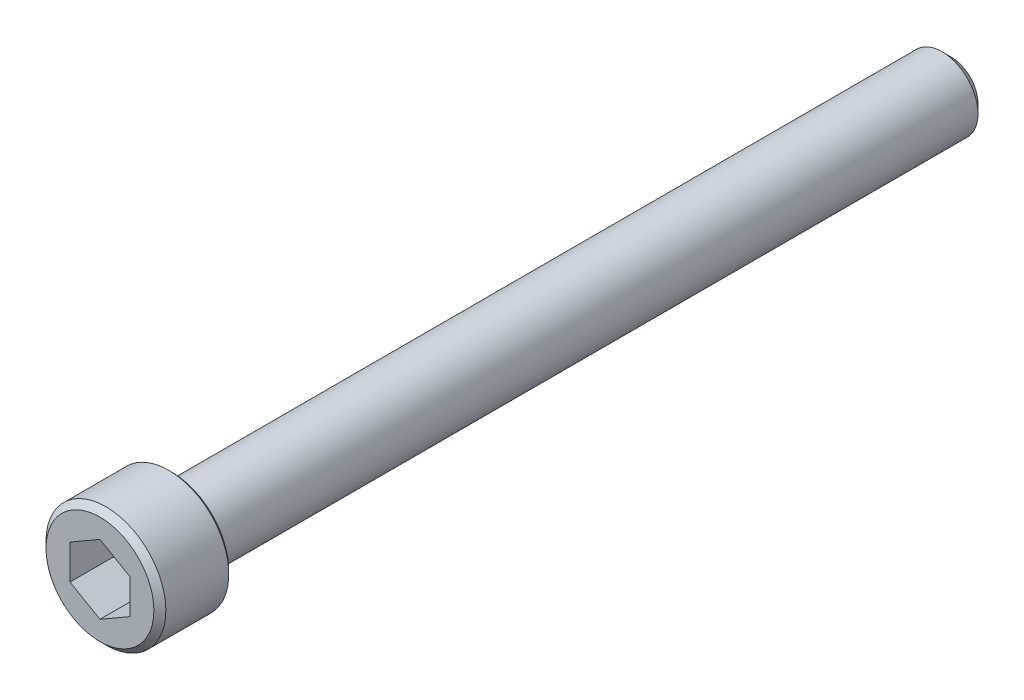
ISO-10303-21;
HEADER;
FILE_DESCRIPTION(('STEP AP214'),'2;1');
FILE_NAME('part.step','',(''),(''),'','','');
FILE_SCHEMA(('AUTOMOTIVE_DESIGN { 1 0 10303 214 1 1 1 1 }'));
ENDSEC;
DATA;
#1=APPLICATION_CONTEXT('core data for automotive mechanical design processes');
#2=APPLICATION_PROTOCOL_DEFINITION('international standard','automotive_design',2000,#1);
#3=PRODUCT_CONTEXT('',#1,'mechanical');
#4=PRODUCT('Part','Part','',(#3));
#5=PRODUCT_RELATED_PRODUCT_CATEGORY('part','',(#4));
#6=PRODUCT_DEFINITION_FORMATION('','',#4);
#7=PRODUCT_DEFINITION_CONTEXT('part definition',#1,'design');
#8=PRODUCT_DEFINITION('design','',#6,#7);
#9=PRODUCT_DEFINITION_SHAPE('','',#8);
#10=(LENGTH_UNIT() NAMED_UNIT(*) SI_UNIT(.MILLI.,.METRE.));
#11=(NAMED_UNIT(*) PLANE_ANGLE_UNIT() SI_UNIT($,.RADIAN.));
#12=(NAMED_UNIT(*) SI_UNIT($,.STERADIAN.) SOLID_ANGLE_UNIT());
#13=UNCERTAINTY_MEASURE_WITH_UNIT(LENGTH_MEASURE(1.E-05),#10,'distance_accuracy_value','');
#14=(GEOMETRIC_REPRESENTATION_CONTEXT(3) GLOBAL_UNCERTAINTY_ASSIGNED_CONTEXT((#13)) GLOBAL_UNIT_ASSIGNED_CONTEXT((#10,
#11,#12)) REPRESENTATION_CONTEXT('',''));
#15=CARTESIAN_POINT('',(0.,0.,0.));
#16=DIRECTION('',(0.,0.,1.));
#17=DIRECTION('',(1.,0.,0.));
#18=AXIS2_PLACEMENT_3D('',#15,#16,#17);
#19=CARTESIAN_POINT('',(0.,4.99999999999999,35.5));
#20=DIRECTION('',(0.,0.,1.));
#21=DIRECTION('',(1.,0.,0.));
#22=AXIS2_PLACEMENT_3D('',#19,#20,#21);
#23=PLANE('',#22);
#24=CARTESIAN_POINT('',(0.,0.,35.5));
#25=DIRECTION('',(0.,0.,1.));
#26=DIRECTION('',(1.,0.,0.));
#27=AXIS2_PLACEMENT_3D('',#24,#25,#26);
#28=CIRCLE('',#27,4.49999999999999);
#29=CARTESIAN_POINT('',(4.49999999999999,0.,35.5));
#30=VERTEX_POINT('',#29);
#31=EDGE_CURVE('E173',#30,#30,#28,.T.);
#32=ORIENTED_EDGE('',*,*,#31,.T.);
#33=EDGE_LOOP('',(#32));
#34=FACE_BOUND('',#33,.T.);
#35=DIRECTION('',(-0.866025403784439,0.5,0.));
#36=VECTOR('',#35,1.);
#37=CARTESIAN_POINT('',(2.5,1.44337567297406,35.5));
#38=LINE('',#37,#36);
#39=CARTESIAN_POINT('',(2.5,1.44337567297406,35.5));
#40=VERTEX_POINT('',#39);
#41=CARTESIAN_POINT('',(0.,2.88675134594813,35.5));
#42=VERTEX_POINT('',#41);
#43=EDGE_CURVE('E57',#40,#42,#38,.T.);
#44=ORIENTED_EDGE('',*,*,#43,.F.);
#45=DIRECTION('',(0.,1.,0.));
#46=VECTOR('',#45,1.);
#47=CARTESIAN_POINT('',(2.5,-1.44337567297407,35.5));
#48=LINE('',#47,#46);
#49=CARTESIAN_POINT('',(2.5,-1.44337567297407,35.5));
#50=VERTEX_POINT('',#49);
#51=EDGE_CURVE('E150',#50,#40,#48,.T.);
#52=ORIENTED_EDGE('',*,*,#51,.F.);
#53=DIRECTION('',(0.866025403784439,0.5,0.));
#54=VECTOR('',#53,1.);
#55=CARTESIAN_POINT('',(0.,-2.88675134594813,35.5));
#56=LINE('',#55,#54);
#57=CARTESIAN_POINT('',(0.,-2.88675134594813,35.5));
#58=VERTEX_POINT('',#57);
#59=EDGE_CURVE('E147',#58,#50,#56,.T.);
#60=ORIENTED_EDGE('',*,*,#59,.F.);
#61=DIRECTION('',(0.866025403784439,-0.5,0.));
#62=VECTOR('',#61,1.);
#63=CARTESIAN_POINT('',(-2.5,-1.44337567297407,35.5));
#64=LINE('',#63,#62);
#65=CARTESIAN_POINT('',(-2.5,-1.44337567297407,35.5));
#66=VERTEX_POINT('',#65);
#67=EDGE_CURVE('E105',#66,#58,#64,.T.);
#68=ORIENTED_EDGE('',*,*,#67,.F.);
#69=DIRECTION('',(0.,-1.,0.));
#70=VECTOR('',#69,1.);
#71=CARTESIAN_POINT('',(-2.5,1.44337567297406,35.5));
#72=LINE('',#71,#70);
#73=CARTESIAN_POINT('',(-2.5,1.44337567297406,35.5));
#74=VERTEX_POINT('',#73);
#75=EDGE_CURVE('E141',#74,#66,#72,.T.);
#76=ORIENTED_EDGE('',*,*,#75,.F.);
#77=DIRECTION('',(-0.866025403784438,-0.5,0.));
#78=VECTOR('',#77,1.);
#79=CARTESIAN_POINT('',(0.,2.88675134594813,35.5));
#80=LINE('',#79,#78);
#81=EDGE_CURVE('E137',#42,#74,#80,.T.);
#82=ORIENTED_EDGE('',*,*,#81,.F.);
#83=EDGE_LOOP('',(#44,#52,#60,#68,#76,#82));
#84=FACE_BOUND('',#83,.T.);
#85=ADVANCED_FACE('F41',(#34,#84),#23,.T.);
#86=CARTESIAN_POINT('',(0.,0.,-35.5));
#87=DIRECTION('',(0.,0.,-1.));
#88=DIRECTION('',(-1.,0.,0.));
#89=AXIS2_PLACEMENT_3D('',#86,#87,#88);
#90=CYLINDRICAL_SURFACE('',#89,5.);
#91=CARTESIAN_POINT('',(0.,0.,29.75));
#92=DIRECTION('',(0.,0.,-1.));
#93=DIRECTION('',(-1.,0.,0.));
#94=AXIS2_PLACEMENT_3D('',#91,#92,#93);
#95=CIRCLE('',#94,5.);
#96=CARTESIAN_POINT('',(-5.,0.,29.75));
#97=VERTEX_POINT('',#96);
#98=EDGE_CURVE('E181',#97,#97,#95,.F.);
#99=ORIENTED_EDGE('',*,*,#98,.T.);
#100=EDGE_LOOP('',(#99));
#101=FACE_BOUND('',#100,.T.);
#102=CARTESIAN_POINT('',(0.,0.,35.));
#103=DIRECTION('',(0.,0.,1.));
#104=DIRECTION('',(1.,0.,0.));
#105=AXIS2_PLACEMENT_3D('',#102,#103,#104);
#106=CIRCLE('',#105,5.);
#107=CARTESIAN_POINT('',(5.,0.,35.));
#108=VERTEX_POINT('',#107);
#109=EDGE_CURVE('E169',#108,#108,#106,.F.);
#110=ORIENTED_EDGE('',*,*,#109,.T.);
#111=EDGE_LOOP('',(#110));
#112=FACE_BOUND('',#111,.T.);
#113=ADVANCED_FACE('F200',(#101,#112),#90,.T.);
#114=CARTESIAN_POINT('',(0.,4.99999999999999,29.5));
#115=DIRECTION('',(0.,0.,-1.));
#116=DIRECTION('',(-1.,0.,0.));
#117=AXIS2_PLACEMENT_3D('',#114,#115,#116);
#118=PLANE('',#117);
#119=CARTESIAN_POINT('',(0.,0.,29.5));
#120=DIRECTION('',(0.,0.,-1.));
#121=DIRECTION('',(-1.,0.,0.));
#122=AXIS2_PLACEMENT_3D('',#119,#120,#121);
#123=CIRCLE('',#122,4.74999999999998);
#124=CARTESIAN_POINT('',(-4.74999999999998,0.,29.5));
#125=VERTEX_POINT('',#124);
#126=EDGE_CURVE('E177',#125,#125,#123,.T.);
#127=ORIENTED_EDGE('',*,*,#126,.T.);
#128=EDGE_LOOP('',(#127));
#129=FACE_BOUND('',#128,.T.);
#130=CARTESIAN_POINT('',(0.,0.,29.5));
#131=DIRECTION('',(0.,0.,-1.));
#132=DIRECTION('',(-1.,0.,0.));
#133=AXIS2_PLACEMENT_3D('',#130,#131,#132);
#134=CIRCLE('',#133,3.);
#135=CARTESIAN_POINT('',(-3.,0.,29.5));
#136=VERTEX_POINT('',#135);
#137=EDGE_CURVE('E156',#136,#136,#134,.T.);
#138=ORIENTED_EDGE('',*,*,#137,.F.);
#139=EDGE_LOOP('',(#138));
#140=FACE_BOUND('',#139,.T.);
#141=ADVANCED_FACE('F206',(#129,#140),#118,.T.);
#142=CARTESIAN_POINT('',(0.,0.,-35.5));
#143=DIRECTION('',(0.,0.,-1.));
#144=DIRECTION('',(-1.,0.,0.));
#145=AXIS2_PLACEMENT_3D('',#142,#143,#144);
#146=CYLINDRICAL_SURFACE('',#145,3.);
#147=CARTESIAN_POINT('',(0.,0.,-34.75));
#148=DIRECTION('',(0.,0.,-1.));
#149=DIRECTION('',(-1.,0.,0.));
#150=AXIS2_PLACEMENT_3D('',#147,#148,#149);
#151=CIRCLE('',#150,3.);
#152=CARTESIAN_POINT('',(3.,0.,-34.75));
#153=VERTEX_POINT('',#152);
#154=EDGE_CURVE('E11',#153,#153,#151,.F.);
#155=ORIENTED_EDGE('',*,*,#154,.T.);
#156=EDGE_LOOP('',(#155));
#157=FACE_BOUND('',#156,.T.);
#158=ORIENTED_EDGE('',*,*,#137,.T.);
#159=EDGE_LOOP('',(#158));
#160=FACE_BOUND('',#159,.T.);
#161=ADVANCED_FACE('F245',(#157,#160),#146,.T.);
#162=CARTESIAN_POINT('',(0.,2.99999999999999,-35.5));
#163=DIRECTION('',(0.,0.,-1.));
#164=DIRECTION('',(-1.,0.,0.));
#165=AXIS2_PLACEMENT_3D('',#162,#163,#164);
#166=PLANE('',#165);
#167=CARTESIAN_POINT('',(0.,0.,-35.5));
#168=DIRECTION('',(0.,0.,-1.));
#169=DIRECTION('',(-1.,0.,0.));
#170=AXIS2_PLACEMENT_3D('',#167,#168,#169);
#171=CIRCLE('',#170,2.25000000000001);
#172=CARTESIAN_POINT('',(2.25000000000001,0.,-35.5));
#173=VERTEX_POINT('',#172);
#174=EDGE_CURVE('E50',#173,#173,#171,.T.);
#175=ORIENTED_EDGE('',*,*,#174,.T.);
#176=EDGE_LOOP('',(#175));
#177=FACE_BOUND('',#176,.T.);
#178=ADVANCED_FACE('F188',(#177),#166,.T.);
#179=CARTESIAN_POINT('',(2.5,1.44337567297406,31.75));
#180=DIRECTION('',(0.5,0.866025403784439,0.));
#181=DIRECTION('',(-0.866025403784439,0.5,0.));
#182=AXIS2_PLACEMENT_3D('',#179,#180,#181);
#183=PLANE('',#182);
#184=ORIENTED_EDGE('',*,*,#43,.T.);
#185=DIRECTION('',(0.,0.,1.));
#186=VECTOR('',#185,1.);
#187=CARTESIAN_POINT('',(0.,2.88675134594813,31.75));
#188=LINE('',#187,#186);
#189=CARTESIAN_POINT('',(0.,2.88675134594813,31.75));
#190=VERTEX_POINT('',#189);
#191=EDGE_CURVE('E87',#190,#42,#188,.T.);
#192=ORIENTED_EDGE('',*,*,#191,.F.);
#193=DIRECTION('',(-0.866025403784439,0.5,0.));
#194=VECTOR('',#193,1.);
#195=CARTESIAN_POINT('',(2.5,1.44337567297406,31.75));
#196=LINE('',#195,#194);
#197=CARTESIAN_POINT('',(2.5,1.44337567297406,31.75));
#198=VERTEX_POINT('',#197);
#199=EDGE_CURVE('E153',#198,#190,#196,.T.);
#200=ORIENTED_EDGE('',*,*,#199,.F.);
#201=DIRECTION('',(0.,0.,1.));
#202=VECTOR('',#201,1.);
#203=CARTESIAN_POINT('',(2.5,1.44337567297406,31.75));
#204=LINE('',#203,#202);
#205=EDGE_CURVE('E65',#198,#40,#204,.T.);
#206=ORIENTED_EDGE('',*,*,#205,.T.);
#207=EDGE_LOOP('',(#184,#192,#200,#206));
#208=FACE_BOUND('',#207,.T.);
#209=ADVANCED_FACE('F233',(#208),#183,.F.);
#210=CARTESIAN_POINT('',(2.5,-1.44337567297407,31.75));
#211=DIRECTION('',(1.,0.,0.));
#212=DIRECTION('',(0.,0.,-1.));
#213=AXIS2_PLACEMENT_3D('',#210,#211,#212);
#214=PLANE('',#213);
#215=ORIENTED_EDGE('',*,*,#51,.T.);
#216=ORIENTED_EDGE('',*,*,#205,.F.);
#217=DIRECTION('',(0.,1.,0.));
#218=VECTOR('',#217,1.);
#219=CARTESIAN_POINT('',(2.5,-1.44337567297407,31.75));
#220=LINE('',#219,#218);
#221=CARTESIAN_POINT('',(2.5,-1.44337567297407,31.75));
#222=VERTEX_POINT('',#221);
#223=EDGE_CURVE('E119',#222,#198,#220,.T.);
#224=ORIENTED_EDGE('',*,*,#223,.F.);
#225=DIRECTION('',(0.,0.,1.));
#226=VECTOR('',#225,1.);
#227=CARTESIAN_POINT('',(2.5,-1.44337567297407,31.75));
#228=LINE('',#227,#226);
#229=EDGE_CURVE('E110',#222,#50,#228,.T.);
#230=ORIENTED_EDGE('',*,*,#229,.T.);
#231=EDGE_LOOP('',(#215,#216,#224,#230));
#232=FACE_BOUND('',#231,.T.);
#233=ADVANCED_FACE('F230',(#232),#214,.F.);
#234=CARTESIAN_POINT('',(0.,-2.88675134594813,31.75));
#235=DIRECTION('',(0.5,-0.866025403784439,0.));
#236=DIRECTION('',(0.866025403784439,0.5,0.));
#237=AXIS2_PLACEMENT_3D('',#234,#235,#236);
#238=PLANE('',#237);
#239=ORIENTED_EDGE('',*,*,#59,.T.);
#240=ORIENTED_EDGE('',*,*,#229,.F.);
#241=DIRECTION('',(0.866025403784439,0.5,0.));
#242=VECTOR('',#241,1.);
#243=CARTESIAN_POINT('',(0.,-2.88675134594813,31.75));
#244=LINE('',#243,#242);
#245=CARTESIAN_POINT('',(0.,-2.88675134594813,31.75));
#246=VERTEX_POINT('',#245);
#247=EDGE_CURVE('E114',#246,#222,#244,.T.);
#248=ORIENTED_EDGE('',*,*,#247,.F.);
#249=DIRECTION('',(0.,0.,1.));
#250=VECTOR('',#249,1.);
#251=CARTESIAN_POINT('',(0.,-2.88675134594813,31.75));
#252=LINE('',#251,#250);
#253=EDGE_CURVE('E98',#246,#58,#252,.T.);
#254=ORIENTED_EDGE('',*,*,#253,.T.);
#255=EDGE_LOOP('',(#239,#240,#248,#254));
#256=FACE_BOUND('',#255,.T.);
#257=ADVANCED_FACE('F115',(#256),#238,.F.);
#258=CARTESIAN_POINT('',(-2.5,-1.44337567297407,31.75));
#259=DIRECTION('',(-0.5,-0.866025403784439,0.));
#260=DIRECTION('',(0.866025403784439,-0.5,0.));
#261=AXIS2_PLACEMENT_3D('',#258,#259,#260);
#262=PLANE('',#261);
#263=ORIENTED_EDGE('',*,*,#67,.T.);
#264=ORIENTED_EDGE('',*,*,#253,.F.);
#265=DIRECTION('',(0.866025403784439,-0.5,0.));
#266=VECTOR('',#265,1.);
#267=CARTESIAN_POINT('',(-2.5,-1.44337567297407,31.75));
#268=LINE('',#267,#266);
#269=CARTESIAN_POINT('',(-2.5,-1.44337567297407,31.75));
#270=VERTEX_POINT('',#269);
#271=EDGE_CURVE('E102',#270,#246,#268,.T.);
#272=ORIENTED_EDGE('',*,*,#271,.F.);
#273=DIRECTION('',(0.,0.,1.));
#274=VECTOR('',#273,1.);
#275=CARTESIAN_POINT('',(-2.5,-1.44337567297407,31.75));
#276=LINE('',#275,#274);
#277=EDGE_CURVE('E111',#270,#66,#276,.T.);
#278=ORIENTED_EDGE('',*,*,#277,.T.);
#279=EDGE_LOOP('',(#263,#264,#272,#278));
#280=FACE_BOUND('',#279,.T.);
#281=ADVANCED_FACE('F100',(#280),#262,.F.);
#282=CARTESIAN_POINT('',(-2.5,1.44337567297406,31.75));
#283=DIRECTION('',(-1.,0.,0.));
#284=DIRECTION('',(0.,-1.,0.));
#285=AXIS2_PLACEMENT_3D('',#282,#283,#284);
#286=PLANE('',#285);
#287=ORIENTED_EDGE('',*,*,#75,.T.);
#288=ORIENTED_EDGE('',*,*,#277,.F.);
#289=DIRECTION('',(0.,-1.,0.));
#290=VECTOR('',#289,1.);
#291=CARTESIAN_POINT('',(-2.5,1.44337567297406,31.75));
#292=LINE('',#291,#290);
#293=CARTESIAN_POINT('',(-2.5,1.44337567297406,31.75));
#294=VERTEX_POINT('',#293);
#295=EDGE_CURVE('E125',#294,#270,#292,.T.);
#296=ORIENTED_EDGE('',*,*,#295,.F.);
#297=DIRECTION('',(0.,0.,1.));
#298=VECTOR('',#297,1.);
#299=CARTESIAN_POINT('',(-2.5,1.44337567297406,31.75));
#300=LINE('',#299,#298);
#301=EDGE_CURVE('E161',#294,#74,#300,.T.);
#302=ORIENTED_EDGE('',*,*,#301,.T.);
#303=EDGE_LOOP('',(#287,#288,#296,#302));
#304=FACE_BOUND('',#303,.T.);
#305=ADVANCED_FACE('F226',(#304),#286,.F.);
#306=CARTESIAN_POINT('',(0.,2.88675134594813,31.75));
#307=DIRECTION('',(-0.5,0.866025403784438,0.));
#308=DIRECTION('',(-0.866025403784438,-0.5,0.));
#309=AXIS2_PLACEMENT_3D('',#306,#307,#308);
#310=PLANE('',#309);
#311=ORIENTED_EDGE('',*,*,#81,.T.);
#312=ORIENTED_EDGE('',*,*,#301,.F.);
#313=DIRECTION('',(-0.866025403784438,-0.5,0.));
#314=VECTOR('',#313,1.);
#315=CARTESIAN_POINT('',(0.,2.88675134594813,31.75));
#316=LINE('',#315,#314);
#317=EDGE_CURVE('E129',#190,#294,#316,.T.);
#318=ORIENTED_EDGE('',*,*,#317,.F.);
#319=ORIENTED_EDGE('',*,*,#191,.T.);
#320=EDGE_LOOP('',(#311,#312,#318,#319));
#321=FACE_BOUND('',#320,.T.);
#322=ADVANCED_FACE('F217',(#321),#310,.F.);
#323=CARTESIAN_POINT('',(0.,0.,31.75));
#324=DIRECTION('',(0.,0.,1.));
#325=DIRECTION('',(1.,0.,0.));
#326=AXIS2_PLACEMENT_3D('',#323,#324,#325);
#327=PLANE('',#326);
#328=ORIENTED_EDGE('',*,*,#199,.T.);
#329=ORIENTED_EDGE('',*,*,#317,.T.);
#330=ORIENTED_EDGE('',*,*,#295,.T.);
#331=ORIENTED_EDGE('',*,*,#271,.T.);
#332=ORIENTED_EDGE('',*,*,#247,.T.);
#333=ORIENTED_EDGE('',*,*,#223,.T.);
#334=EDGE_LOOP('',(#328,#329,#330,#331,#332,#333));
#335=FACE_BOUND('',#334,.T.);
#336=ADVANCED_FACE('F122',(#335),#327,.T.);
#337=CARTESIAN_POINT('',(0.,0.,35.));
#338=DIRECTION('',(0.,0.,-1.));
#339=DIRECTION('',(-1.,0.,0.));
#340=AXIS2_PLACEMENT_3D('',#337,#338,#339);
#341=CONICAL_SURFACE('',#340,5.,0.785398163397454);
#342=ORIENTED_EDGE('',*,*,#31,.F.);
#343=EDGE_LOOP('',(#342));
#344=FACE_BOUND('',#343,.T.);
#345=ORIENTED_EDGE('',*,*,#109,.F.);
#346=EDGE_LOOP('',(#345));
#347=FACE_BOUND('',#346,.T.);
#348=ADVANCED_FACE('F196',(#344,#347),#341,.T.);
#349=CARTESIAN_POINT('',(0.,0.,29.5));
#350=DIRECTION('',(0.,0.,1.));
#351=DIRECTION('',(1.,0.,0.));
#352=AXIS2_PLACEMENT_3D('',#349,#350,#351);
#353=CONICAL_SURFACE('',#352,4.74999999999998,0.785398163397445);
#354=ORIENTED_EDGE('',*,*,#98,.F.);
#355=EDGE_LOOP('',(#354));
#356=FACE_BOUND('',#355,.T.);
#357=ORIENTED_EDGE('',*,*,#126,.F.);
#358=EDGE_LOOP('',(#357));
#359=FACE_BOUND('',#358,.T.);
#360=ADVANCED_FACE('F191',(#356,#359),#353,.T.);
#361=CARTESIAN_POINT('',(0.,0.,-35.5));
#362=DIRECTION('',(0.,0.,1.));
#363=DIRECTION('',(1.,0.,0.));
#364=AXIS2_PLACEMENT_3D('',#361,#362,#363);
#365=CONICAL_SURFACE('',#364,2.25000000000001,0.785398163397444);
#366=CARTESIAN_POINT('',(3.,0.,-34.75));
#367=CARTESIAN_POINT('',(2.9921875,0.,-34.7578125));
#368=CARTESIAN_POINT('',(2.984375,0.,-34.765625));
#369=CARTESIAN_POINT('',(2.96875,0.,-34.78125));
#370=CARTESIAN_POINT('',(2.9609375,0.,-34.7890625));
#371=CARTESIAN_POINT('',(2.9453125,0.,-34.8046875));
#372=CARTESIAN_POINT('',(2.9375,0.,-34.8125));
#373=CARTESIAN_POINT('',(2.921875,0.,-34.828125));
#374=CARTESIAN_POINT('',(2.9140625,0.,-34.8359375));
#375=CARTESIAN_POINT('',(2.8984375,0.,-34.8515625));
#376=CARTESIAN_POINT('',(2.890625,0.,-34.859375));
#377=CARTESIAN_POINT('',(2.875,0.,-34.875));
#378=CARTESIAN_POINT('',(2.8671875,0.,-34.8828125));
#379=CARTESIAN_POINT('',(2.8515625,0.,-34.8984375));
#380=CARTESIAN_POINT('',(2.84375,0.,-34.90625));
#381=CARTESIAN_POINT('',(2.828125,0.,-34.921875));
#382=CARTESIAN_POINT('',(2.8203125,0.,-34.9296875));
#383=CARTESIAN_POINT('',(2.8046875,0.,-34.9453125));
#384=CARTESIAN_POINT('',(2.796875,0.,-34.953125));
#385=CARTESIAN_POINT('',(2.78125,0.,-34.96875));
#386=CARTESIAN_POINT('',(2.7734375,0.,-34.9765625));
#387=CARTESIAN_POINT('',(2.7578125,0.,-34.9921875));
#388=CARTESIAN_POINT('',(2.75,0.,-35.));
#389=CARTESIAN_POINT('',(2.734375,0.,-35.015625));
#390=CARTESIAN_POINT('',(2.7265625,0.,-35.0234375));
#391=CARTESIAN_POINT('',(2.7109375,0.,-35.0390625));
#392=CARTESIAN_POINT('',(2.703125,0.,-35.046875));
#393=CARTESIAN_POINT('',(2.6875,0.,-35.0625));
#394=CARTESIAN_POINT('',(2.6796875,0.,-35.0703125));
#395=CARTESIAN_POINT('',(2.66406250000001,0.,-35.0859375));
#396=CARTESIAN_POINT('',(2.65625000000001,0.,-35.09375));
#397=CARTESIAN_POINT('',(2.64062500000001,0.,-35.109375));
#398=CARTESIAN_POINT('',(2.63281250000001,0.,-35.1171875));
#399=CARTESIAN_POINT('',(2.61718750000001,0.,-35.1328125));
#400=CARTESIAN_POINT('',(2.60937500000001,0.,-35.140625));
#401=CARTESIAN_POINT('',(2.59375000000001,0.,-35.15625));
#402=CARTESIAN_POINT('',(2.58593750000001,0.,-35.1640625));
#403=CARTESIAN_POINT('',(2.57031250000001,0.,-35.1796875));
#404=CARTESIAN_POINT('',(2.56250000000001,0.,-35.1875));
#405=CARTESIAN_POINT('',(2.54687500000001,0.,-35.203125));
#406=CARTESIAN_POINT('',(2.53906250000001,0.,-35.2109375));
#407=CARTESIAN_POINT('',(2.52343750000001,0.,-35.2265625));
#408=CARTESIAN_POINT('',(2.51562500000001,0.,-35.234375));
#409=CARTESIAN_POINT('',(2.50000000000001,0.,-35.25));
#410=CARTESIAN_POINT('',(2.49218750000001,0.,-35.2578125));
#411=CARTESIAN_POINT('',(2.47656250000001,0.,-35.2734375));
#412=CARTESIAN_POINT('',(2.46875000000001,0.,-35.28125));
#413=CARTESIAN_POINT('',(2.45312500000001,0.,-35.296875));
#414=CARTESIAN_POINT('',(2.44531250000001,0.,-35.3046875));
#415=CARTESIAN_POINT('',(2.42968750000001,0.,-35.3203125));
#416=CARTESIAN_POINT('',(2.42187500000001,0.,-35.328125));
#417=CARTESIAN_POINT('',(2.40625000000001,0.,-35.34375));
#418=CARTESIAN_POINT('',(2.39843750000001,0.,-35.3515625));
#419=CARTESIAN_POINT('',(2.38281250000001,0.,-35.3671875));
#420=CARTESIAN_POINT('',(2.37500000000001,0.,-35.375));
#421=CARTESIAN_POINT('',(2.35937500000001,0.,-35.390625));
#422=CARTESIAN_POINT('',(2.35156250000001,0.,-35.3984375));
#423=CARTESIAN_POINT('',(2.33593750000001,0.,-35.4140625));
#424=CARTESIAN_POINT('',(2.32812500000001,0.,-35.421875));
#425=CARTESIAN_POINT('',(2.31250000000001,0.,-35.4375));
#426=CARTESIAN_POINT('',(2.30468750000001,0.,-35.4453125));
#427=CARTESIAN_POINT('',(2.28906250000001,0.,-35.4609375));
#428=CARTESIAN_POINT('',(2.28125000000001,0.,-35.46875));
#429=CARTESIAN_POINT('',(2.26562500000001,0.,-35.484375));
#430=CARTESIAN_POINT('',(2.25781250000001,0.,-35.4921875));
#431=CARTESIAN_POINT('',(2.25000000000001,0.,-35.5));
#432=B_SPLINE_CURVE_WITH_KNOTS('',3,(#366,#367,#368,#369,#370,#371,#372,#373,#374,#375,#376,
#377,#378,#379,#380,#381,#382,#383,#384,#385,#386,#387,#388,#389,#390,#391,#392,#393,#394,#395,
#396,#397,#398,#399,#400,#401,#402,#403,#404,#405,#406,#407,#408,#409,#410,#411,#412,#413,#414,
#415,#416,#417,#418,#419,#420,#421,#422,#423,#424,#425,#426,#427,#428,#429,#430,#431),
.UNSPECIFIED.,.F.,.F.,(4,2,2,2,2,2,2,2,2,2,2,2,2,2,2,2,2,2,2,2,2,2,2,2,2,2,2,2,2,2,2,2,4),(0.,
0.0331456303681148,0.0662912607362346,0.0994368911043546,0.132582521472474,0.165728151840594,
0.198873782208714,0.232019412576829,0.265165042944949,0.298310673313068,0.331456303681188,
0.364601934049308,0.397747564417427,0.430893194785542,0.464038825153662,0.497184455521782,
0.530330085889901,0.563475716258021,0.596621346626141,0.629766976994261,0.662912607362376,
0.696058237730495,0.729203868098615,0.762349498466735,0.795495128834855,0.828640759202975,
0.861786389571089,0.894932019939209,0.928077650307329,0.961223280675449,0.994368911043568,
1.02751454141169,1.06066017177981),.UNSPECIFIED.);
#433=EDGE_CURVE('BSEAM43',#153,#173,#432,.T.);
#434=ORIENTED_EDGE('',*,*,#154,.F.);
#435=ORIENTED_EDGE('',*,*,#174,.F.);
#436=ORIENTED_EDGE('',*,*,#433,.T.);
#437=ORIENTED_EDGE('',*,*,#433,.F.);
#438=EDGE_LOOP('',(#434,#436,#435,#437));
#439=FACE_BOUND('',#438,.T.);
#440=ADVANCED_FACE('F43',(#439),#365,.T.);
#441=CLOSED_SHELL('',(#85,#113,#141,#161,#178,#209,#233,#257,#281,#305,#322,#336,#348,#360,#440));
#442=MANIFOLD_SOLID_BREP('B2',#441);
#443=ADVANCED_BREP_SHAPE_REPRESENTATION('',(#18,#442),#14);
#444=SHAPE_DEFINITION_REPRESENTATION(#9,#443);
ENDSEC;
END-ISO-10303-21;
